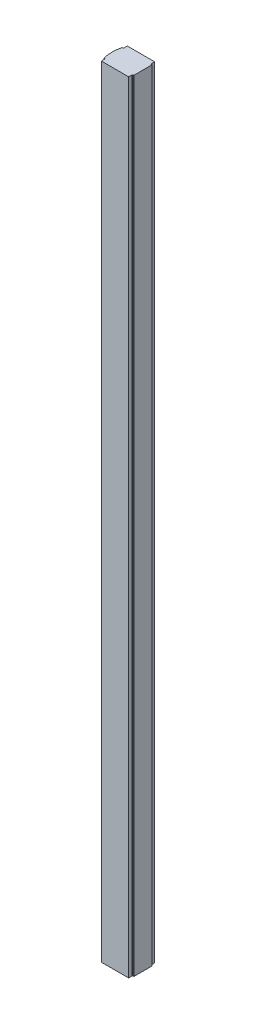
ISO-10303-21;
HEADER;
FILE_DESCRIPTION(('STEP AP214'),'2;1');
FILE_NAME('part.step','',(''),(''),'','','');
FILE_SCHEMA(('AUTOMOTIVE_DESIGN { 1 0 10303 214 1 1 1 1 }'));
ENDSEC;
DATA;
#1=APPLICATION_CONTEXT('core data for automotive mechanical design processes');
#2=APPLICATION_PROTOCOL_DEFINITION('international standard','automotive_design',2000,#1);
#3=PRODUCT_CONTEXT('',#1,'mechanical');
#4=PRODUCT('Part','Part','',(#3));
#5=PRODUCT_RELATED_PRODUCT_CATEGORY('part','',(#4));
#6=PRODUCT_DEFINITION_FORMATION('','',#4);
#7=PRODUCT_DEFINITION_CONTEXT('part definition',#1,'design');
#8=PRODUCT_DEFINITION('design','',#6,#7);
#9=PRODUCT_DEFINITION_SHAPE('','',#8);
#10=(LENGTH_UNIT() NAMED_UNIT(*) SI_UNIT(.MILLI.,.METRE.));
#11=(NAMED_UNIT(*) PLANE_ANGLE_UNIT() SI_UNIT($,.RADIAN.));
#12=(NAMED_UNIT(*) SI_UNIT($,.STERADIAN.) SOLID_ANGLE_UNIT());
#13=UNCERTAINTY_MEASURE_WITH_UNIT(LENGTH_MEASURE(1.E-05),#10,'distance_accuracy_value','');
#14=(GEOMETRIC_REPRESENTATION_CONTEXT(3) GLOBAL_UNCERTAINTY_ASSIGNED_CONTEXT((#13)) GLOBAL_UNIT_ASSIGNED_CONTEXT((#10,
#11,#12)) REPRESENTATION_CONTEXT('',''));
#15=CARTESIAN_POINT('',(0.,0.,0.));
#16=DIRECTION('',(0.,0.,1.));
#17=DIRECTION('',(1.,0.,0.));
#18=AXIS2_PLACEMENT_3D('',#15,#16,#17);
#19=CARTESIAN_POINT('',(0.,600.,0.));
#20=DIRECTION('',(0.,0.,-1.));
#21=DIRECTION('',(-1.,0.,0.));
#22=AXIS2_PLACEMENT_3D('',#19,#20,#21);
#23=PLANE('',#22);
#24=DIRECTION('',(1.,0.,0.));
#25=VECTOR('',#24,1.);
#26=CARTESIAN_POINT('',(0.,0.,0.));
#27=LINE('',#26,#25);
#28=CARTESIAN_POINT('',(0.,0.,0.));
#29=VERTEX_POINT('',#28);
#30=CARTESIAN_POINT('',(21.,0.,0.));
#31=VERTEX_POINT('',#30);
#32=EDGE_CURVE('E178',#29,#31,#27,.T.);
#33=ORIENTED_EDGE('',*,*,#32,.T.);
#34=DIRECTION('',(0.,-1.,0.));
#35=VECTOR('',#34,1.);
#36=CARTESIAN_POINT('',(21.,600.,0.));
#37=LINE('',#36,#35);
#38=CARTESIAN_POINT('',(21.,600.,0.));
#39=VERTEX_POINT('',#38);
#40=EDGE_CURVE('E11',#39,#31,#37,.T.);
#41=ORIENTED_EDGE('',*,*,#40,.F.);
#42=DIRECTION('',(1.,0.,0.));
#43=VECTOR('',#42,1.);
#44=CARTESIAN_POINT('',(0.,600.,0.));
#45=LINE('',#44,#43);
#46=CARTESIAN_POINT('',(0.,600.,0.));
#47=VERTEX_POINT('',#46);
#48=EDGE_CURVE('E111',#47,#39,#45,.T.);
#49=ORIENTED_EDGE('',*,*,#48,.F.);
#50=DIRECTION('',(0.,-1.,0.));
#51=VECTOR('',#50,1.);
#52=CARTESIAN_POINT('',(0.,600.,0.));
#53=LINE('',#52,#51);
#54=EDGE_CURVE('E50',#47,#29,#53,.T.);
#55=ORIENTED_EDGE('',*,*,#54,.T.);
#56=EDGE_LOOP('',(#33,#41,#49,#55));
#57=FACE_BOUND('',#56,.T.);
#58=ADVANCED_FACE('F34',(#57),#23,.F.);
#59=CARTESIAN_POINT('',(21.,600.,0.));
#60=DIRECTION('',(1.,0.,0.));
#61=DIRECTION('',(0.,0.,-1.));
#62=AXIS2_PLACEMENT_3D('',#59,#60,#61);
#63=PLANE('',#62);
#64=DIRECTION('',(0.,0.,1.));
#65=VECTOR('',#64,1.);
#66=CARTESIAN_POINT('',(21.,0.,0.));
#67=LINE('',#66,#65);
#68=CARTESIAN_POINT('',(21.,0.,-2.5));
#69=VERTEX_POINT('',#68);
#70=EDGE_CURVE('E180',#69,#31,#67,.T.);
#71=ORIENTED_EDGE('',*,*,#70,.F.);
#72=DIRECTION('',(0.,-1.,0.));
#73=VECTOR('',#72,1.);
#74=CARTESIAN_POINT('',(21.,600.,-2.5));
#75=LINE('',#74,#73);
#76=CARTESIAN_POINT('',(21.,600.,-2.5));
#77=VERTEX_POINT('',#76);
#78=EDGE_CURVE('E42',#77,#69,#75,.T.);
#79=ORIENTED_EDGE('',*,*,#78,.F.);
#80=DIRECTION('',(0.,0.,1.));
#81=VECTOR('',#80,1.);
#82=CARTESIAN_POINT('',(21.,600.,0.));
#83=LINE('',#82,#81);
#84=EDGE_CURVE('E257',#77,#39,#83,.T.);
#85=ORIENTED_EDGE('',*,*,#84,.T.);
#86=ORIENTED_EDGE('',*,*,#40,.T.);
#87=EDGE_LOOP('',(#71,#79,#85,#86));
#88=FACE_BOUND('',#87,.T.);
#89=ADVANCED_FACE('F256',(#88),#63,.T.);
#90=CARTESIAN_POINT('',(21.5,600.,-2.5));
#91=DIRECTION('',(0.,-1.,0.));
#92=DIRECTION('',(0.,0.,-1.));
#93=AXIS2_PLACEMENT_3D('',#90,#91,#92);
#94=CYLINDRICAL_SURFACE('',#93,0.5);
#95=CARTESIAN_POINT('',(21.5,0.,-2.5));
#96=DIRECTION('',(0.,1.,0.));
#97=DIRECTION('',(0.,0.,1.));
#98=AXIS2_PLACEMENT_3D('',#95,#96,#97);
#99=CIRCLE('',#98,0.5);
#100=CARTESIAN_POINT('',(21.5,0.,-3.));
#101=VERTEX_POINT('',#100);
#102=EDGE_CURVE('E183',#69,#101,#99,.F.);
#103=ORIENTED_EDGE('',*,*,#102,.T.);
#104=DIRECTION('',(0.,-1.,0.));
#105=VECTOR('',#104,1.);
#106=CARTESIAN_POINT('',(21.5,600.,-3.));
#107=LINE('',#106,#105);
#108=CARTESIAN_POINT('',(21.5,600.,-3.));
#109=VERTEX_POINT('',#108);
#110=EDGE_CURVE('E242',#109,#101,#107,.T.);
#111=ORIENTED_EDGE('',*,*,#110,.F.);
#112=CARTESIAN_POINT('',(21.5,600.,-2.5));
#113=DIRECTION('',(0.,1.,0.));
#114=DIRECTION('',(0.,0.,1.));
#115=AXIS2_PLACEMENT_3D('',#112,#113,#114);
#116=CIRCLE('',#115,0.5);
#117=EDGE_CURVE('E248',#77,#109,#116,.F.);
#118=ORIENTED_EDGE('',*,*,#117,.F.);
#119=ORIENTED_EDGE('',*,*,#78,.T.);
#120=EDGE_LOOP('',(#103,#111,#118,#119));
#121=FACE_BOUND('',#120,.T.);
#122=ADVANCED_FACE('F246',(#121),#94,.F.);
#123=CARTESIAN_POINT('',(0.,600.,-3.00000000000004));
#124=DIRECTION('',(0.,0.,1.));
#125=DIRECTION('',(1.,0.,0.));
#126=AXIS2_PLACEMENT_3D('',#123,#124,#125);
#127=PLANE('',#126);
#128=DIRECTION('',(-1.,0.,0.));
#129=VECTOR('',#128,1.);
#130=CARTESIAN_POINT('',(0.,0.,-3.00000000000004));
#131=LINE('',#130,#129);
#132=CARTESIAN_POINT('',(22.,0.,-3.));
#133=VERTEX_POINT('',#132);
#134=EDGE_CURVE('E186',#133,#101,#131,.T.);
#135=ORIENTED_EDGE('',*,*,#134,.F.);
#136=DIRECTION('',(0.,-1.,0.));
#137=VECTOR('',#136,1.);
#138=CARTESIAN_POINT('',(22.,600.,-3.));
#139=LINE('',#138,#137);
#140=CARTESIAN_POINT('',(22.,600.,-3.));
#141=VERTEX_POINT('',#140);
#142=EDGE_CURVE('E240',#141,#133,#139,.T.);
#143=ORIENTED_EDGE('',*,*,#142,.F.);
#144=DIRECTION('',(-1.,0.,0.));
#145=VECTOR('',#144,1.);
#146=CARTESIAN_POINT('',(0.,600.,-3.00000000000004));
#147=LINE('',#146,#145);
#148=EDGE_CURVE('E464',#141,#109,#147,.T.);
#149=ORIENTED_EDGE('',*,*,#148,.T.);
#150=ORIENTED_EDGE('',*,*,#110,.T.);
#151=EDGE_LOOP('',(#135,#143,#149,#150));
#152=FACE_BOUND('',#151,.T.);
#153=ADVANCED_FACE('F275',(#152),#127,.T.);
#154=CARTESIAN_POINT('',(22.,600.,0.));
#155=DIRECTION('',(-1.,0.,0.));
#156=DIRECTION('',(0.,0.,1.));
#157=AXIS2_PLACEMENT_3D('',#154,#155,#156);
#158=PLANE('',#157);
#159=DIRECTION('',(0.,0.,-1.));
#160=VECTOR('',#159,1.);
#161=CARTESIAN_POINT('',(22.,0.,0.));
#162=LINE('',#161,#160);
#163=CARTESIAN_POINT('',(22.,0.,-17.));
#164=VERTEX_POINT('',#163);
#165=EDGE_CURVE('E189',#133,#164,#162,.T.);
#166=ORIENTED_EDGE('',*,*,#165,.T.);
#167=DIRECTION('',(0.,-1.,0.));
#168=VECTOR('',#167,1.);
#169=CARTESIAN_POINT('',(22.,600.,-17.));
#170=LINE('',#169,#168);
#171=CARTESIAN_POINT('',(22.,600.,-17.));
#172=VERTEX_POINT('',#171);
#173=EDGE_CURVE('E237',#172,#164,#170,.T.);
#174=ORIENTED_EDGE('',*,*,#173,.F.);
#175=DIRECTION('',(0.,0.,-1.));
#176=VECTOR('',#175,1.);
#177=CARTESIAN_POINT('',(22.,600.,0.));
#178=LINE('',#177,#176);
#179=EDGE_CURVE('E461',#141,#172,#178,.T.);
#180=ORIENTED_EDGE('',*,*,#179,.F.);
#181=ORIENTED_EDGE('',*,*,#142,.T.);
#182=EDGE_LOOP('',(#166,#174,#180,#181));
#183=FACE_BOUND('',#182,.T.);
#184=ADVANCED_FACE('F280',(#183),#158,.F.);
#185=CARTESIAN_POINT('',(-1.17961196366421E-13,600.,-16.9999999999998));
#186=DIRECTION('',(0.,0.,1.));
#187=DIRECTION('',(1.,0.,0.));
#188=AXIS2_PLACEMENT_3D('',#185,#186,#187);
#189=PLANE('',#188);
#190=DIRECTION('',(-1.,0.,0.));
#191=VECTOR('',#190,1.);
#192=CARTESIAN_POINT('',(-1.17961196366421E-13,0.,-16.9999999999998));
#193=LINE('',#192,#191);
#194=CARTESIAN_POINT('',(21.5,0.,-17.));
#195=VERTEX_POINT('',#194);
#196=EDGE_CURVE('E191',#164,#195,#193,.T.);
#197=ORIENTED_EDGE('',*,*,#196,.T.);
#198=DIRECTION('',(0.,-1.,0.));
#199=VECTOR('',#198,1.);
#200=CARTESIAN_POINT('',(21.5,600.,-17.));
#201=LINE('',#200,#199);
#202=CARTESIAN_POINT('',(21.5,600.,-17.));
#203=VERTEX_POINT('',#202);
#204=EDGE_CURVE('E234',#203,#195,#201,.T.);
#205=ORIENTED_EDGE('',*,*,#204,.F.);
#206=DIRECTION('',(-1.,0.,0.));
#207=VECTOR('',#206,1.);
#208=CARTESIAN_POINT('',(-1.17961196366421E-13,600.,-16.9999999999998));
#209=LINE('',#208,#207);
#210=EDGE_CURVE('E458',#172,#203,#209,.T.);
#211=ORIENTED_EDGE('',*,*,#210,.F.);
#212=ORIENTED_EDGE('',*,*,#173,.T.);
#213=EDGE_LOOP('',(#197,#205,#211,#212));
#214=FACE_BOUND('',#213,.T.);
#215=ADVANCED_FACE('F284',(#214),#189,.F.);
#216=CARTESIAN_POINT('',(21.5,600.,-17.5));
#217=DIRECTION('',(0.,-1.,0.));
#218=DIRECTION('',(0.,0.,-1.));
#219=AXIS2_PLACEMENT_3D('',#216,#217,#218);
#220=CYLINDRICAL_SURFACE('',#219,0.5);
#221=CARTESIAN_POINT('',(21.5,0.,-17.5));
#222=DIRECTION('',(0.,1.,0.));
#223=DIRECTION('',(0.,0.,1.));
#224=AXIS2_PLACEMENT_3D('',#221,#222,#223);
#225=CIRCLE('',#224,0.5);
#226=CARTESIAN_POINT('',(21.,0.,-17.5));
#227=VERTEX_POINT('',#226);
#228=EDGE_CURVE('E193',#195,#227,#225,.F.);
#229=ORIENTED_EDGE('',*,*,#228,.T.);
#230=DIRECTION('',(0.,-1.,0.));
#231=VECTOR('',#230,1.);
#232=CARTESIAN_POINT('',(21.,600.,-17.5));
#233=LINE('',#232,#231);
#234=CARTESIAN_POINT('',(21.,600.,-17.5));
#235=VERTEX_POINT('',#234);
#236=EDGE_CURVE('E231',#235,#227,#233,.T.);
#237=ORIENTED_EDGE('',*,*,#236,.F.);
#238=CARTESIAN_POINT('',(21.5,600.,-17.5));
#239=DIRECTION('',(0.,1.,0.));
#240=DIRECTION('',(0.,0.,1.));
#241=AXIS2_PLACEMENT_3D('',#238,#239,#240);
#242=CIRCLE('',#241,0.5);
#243=EDGE_CURVE('E456',#203,#235,#242,.F.);
#244=ORIENTED_EDGE('',*,*,#243,.F.);
#245=ORIENTED_EDGE('',*,*,#204,.T.);
#246=EDGE_LOOP('',(#229,#237,#244,#245));
#247=FACE_BOUND('',#246,.T.);
#248=ADVANCED_FACE('F288',(#247),#220,.F.);
#249=CARTESIAN_POINT('',(21.,600.,0.));
#250=DIRECTION('',(-1.,0.,0.));
#251=DIRECTION('',(0.,0.,1.));
#252=AXIS2_PLACEMENT_3D('',#249,#250,#251);
#253=PLANE('',#252);
#254=DIRECTION('',(0.,0.,-1.));
#255=VECTOR('',#254,1.);
#256=CARTESIAN_POINT('',(21.,0.,0.));
#257=LINE('',#256,#255);
#258=CARTESIAN_POINT('',(21.,0.,-20.));
#259=VERTEX_POINT('',#258);
#260=EDGE_CURVE('E195',#227,#259,#257,.T.);
#261=ORIENTED_EDGE('',*,*,#260,.T.);
#262=DIRECTION('',(0.,-1.,0.));
#263=VECTOR('',#262,1.);
#264=CARTESIAN_POINT('',(21.,600.,-20.));
#265=LINE('',#264,#263);
#266=CARTESIAN_POINT('',(21.,600.,-20.));
#267=VERTEX_POINT('',#266);
#268=EDGE_CURVE('E229',#267,#259,#265,.T.);
#269=ORIENTED_EDGE('',*,*,#268,.F.);
#270=DIRECTION('',(0.,0.,-1.));
#271=VECTOR('',#270,1.);
#272=CARTESIAN_POINT('',(21.,600.,0.));
#273=LINE('',#272,#271);
#274=EDGE_CURVE('E472',#235,#267,#273,.T.);
#275=ORIENTED_EDGE('',*,*,#274,.F.);
#276=ORIENTED_EDGE('',*,*,#236,.T.);
#277=EDGE_LOOP('',(#261,#269,#275,#276));
#278=FACE_BOUND('',#277,.T.);
#279=ADVANCED_FACE('F292',(#278),#253,.F.);
#280=CARTESIAN_POINT('',(0.,600.,-20.));
#281=DIRECTION('',(0.,0.,-1.));
#282=DIRECTION('',(-1.,0.,0.));
#283=AXIS2_PLACEMENT_3D('',#280,#281,#282);
#284=PLANE('',#283);
#285=DIRECTION('',(1.,0.,0.));
#286=VECTOR('',#285,1.);
#287=CARTESIAN_POINT('',(0.,0.,-20.));
#288=LINE('',#287,#286);
#289=CARTESIAN_POINT('',(0.,0.,-20.));
#290=VERTEX_POINT('',#289);
#291=EDGE_CURVE('E198',#290,#259,#288,.T.);
#292=ORIENTED_EDGE('',*,*,#291,.F.);
#293=DIRECTION('',(0.,-1.,0.));
#294=VECTOR('',#293,1.);
#295=CARTESIAN_POINT('',(0.,600.,-20.));
#296=LINE('',#295,#294);
#297=CARTESIAN_POINT('',(0.,600.,-20.));
#298=VERTEX_POINT('',#297);
#299=EDGE_CURVE('E227',#298,#290,#296,.T.);
#300=ORIENTED_EDGE('',*,*,#299,.F.);
#301=DIRECTION('',(1.,0.,0.));
#302=VECTOR('',#301,1.);
#303=CARTESIAN_POINT('',(0.,600.,-20.));
#304=LINE('',#303,#302);
#305=EDGE_CURVE('E449',#298,#267,#304,.T.);
#306=ORIENTED_EDGE('',*,*,#305,.T.);
#307=ORIENTED_EDGE('',*,*,#268,.T.);
#308=EDGE_LOOP('',(#292,#300,#306,#307));
#309=FACE_BOUND('',#308,.T.);
#310=ADVANCED_FACE('F296',(#309),#284,.T.);
#311=CARTESIAN_POINT('',(0.,600.,0.));
#312=DIRECTION('',(-1.,0.,0.));
#313=DIRECTION('',(0.,0.,1.));
#314=AXIS2_PLACEMENT_3D('',#311,#312,#313);
#315=PLANE('',#314);
#316=DIRECTION('',(0.,0.,-1.));
#317=VECTOR('',#316,1.);
#318=CARTESIAN_POINT('',(0.,0.,0.));
#319=LINE('',#318,#317);
#320=CARTESIAN_POINT('',(0.,0.,-17.5));
#321=VERTEX_POINT('',#320);
#322=EDGE_CURVE('E201',#321,#290,#319,.T.);
#323=ORIENTED_EDGE('',*,*,#322,.F.);
#324=DIRECTION('',(0.,-1.,0.));
#325=VECTOR('',#324,1.);
#326=CARTESIAN_POINT('',(0.,600.,-17.5));
#327=LINE('',#326,#325);
#328=CARTESIAN_POINT('',(0.,600.,-17.5));
#329=VERTEX_POINT('',#328);
#330=EDGE_CURVE('E225',#329,#321,#327,.T.);
#331=ORIENTED_EDGE('',*,*,#330,.F.);
#332=DIRECTION('',(0.,0.,-1.));
#333=VECTOR('',#332,1.);
#334=CARTESIAN_POINT('',(0.,600.,0.));
#335=LINE('',#334,#333);
#336=EDGE_CURVE('E445',#329,#298,#335,.T.);
#337=ORIENTED_EDGE('',*,*,#336,.T.);
#338=ORIENTED_EDGE('',*,*,#299,.T.);
#339=EDGE_LOOP('',(#323,#331,#337,#338));
#340=FACE_BOUND('',#339,.T.);
#341=ADVANCED_FACE('F300',(#340),#315,.T.);
#342=CARTESIAN_POINT('',(-0.5,600.,-17.5));
#343=DIRECTION('',(0.,-1.,0.));
#344=DIRECTION('',(0.,0.,-1.));
#345=AXIS2_PLACEMENT_3D('',#342,#343,#344);
#346=CYLINDRICAL_SURFACE('',#345,0.5);
#347=CARTESIAN_POINT('',(-0.5,0.,-17.5));
#348=DIRECTION('',(0.,1.,0.));
#349=DIRECTION('',(0.,0.,1.));
#350=AXIS2_PLACEMENT_3D('',#347,#348,#349);
#351=CIRCLE('',#350,0.5);
#352=CARTESIAN_POINT('',(-0.5,0.,-17.));
#353=VERTEX_POINT('',#352);
#354=EDGE_CURVE('E204',#353,#321,#351,.T.);
#355=ORIENTED_EDGE('',*,*,#354,.F.);
#356=DIRECTION('',(0.,-1.,0.));
#357=VECTOR('',#356,1.);
#358=CARTESIAN_POINT('',(-0.5,600.,-17.));
#359=LINE('',#358,#357);
#360=CARTESIAN_POINT('',(-0.5,600.,-17.));
#361=VERTEX_POINT('',#360);
#362=EDGE_CURVE('E223',#361,#353,#359,.T.);
#363=ORIENTED_EDGE('',*,*,#362,.F.);
#364=CARTESIAN_POINT('',(-0.5,600.,-17.5));
#365=DIRECTION('',(0.,1.,0.));
#366=DIRECTION('',(0.,0.,1.));
#367=AXIS2_PLACEMENT_3D('',#364,#365,#366);
#368=CIRCLE('',#367,0.5);
#369=EDGE_CURVE('E476',#361,#329,#368,.T.);
#370=ORIENTED_EDGE('',*,*,#369,.T.);
#371=ORIENTED_EDGE('',*,*,#330,.T.);
#372=EDGE_LOOP('',(#355,#363,#370,#371));
#373=FACE_BOUND('',#372,.T.);
#374=ADVANCED_FACE('F304',(#373),#346,.F.);
#375=CARTESIAN_POINT('',(1.17961196366422E-13,600.,-17.));
#376=DIRECTION('',(0.,0.,-1.));
#377=DIRECTION('',(-1.,0.,0.));
#378=AXIS2_PLACEMENT_3D('',#375,#376,#377);
#379=PLANE('',#378);
#380=DIRECTION('',(1.,0.,0.));
#381=VECTOR('',#380,1.);
#382=CARTESIAN_POINT('',(1.17961196366422E-13,0.,-17.));
#383=LINE('',#382,#381);
#384=CARTESIAN_POINT('',(-1.,0.,-17.));
#385=VERTEX_POINT('',#384);
#386=EDGE_CURVE('E207',#385,#353,#383,.T.);
#387=ORIENTED_EDGE('',*,*,#386,.F.);
#388=DIRECTION('',(0.,-1.,0.));
#389=VECTOR('',#388,1.);
#390=CARTESIAN_POINT('',(-1.,600.,-17.));
#391=LINE('',#390,#389);
#392=CARTESIAN_POINT('',(-1.,600.,-17.));
#393=VERTEX_POINT('',#392);
#394=EDGE_CURVE('E221',#393,#385,#391,.T.);
#395=ORIENTED_EDGE('',*,*,#394,.F.);
#396=DIRECTION('',(1.,0.,0.));
#397=VECTOR('',#396,1.);
#398=CARTESIAN_POINT('',(1.17961196366422E-13,600.,-17.));
#399=LINE('',#398,#397);
#400=EDGE_CURVE('E437',#393,#361,#399,.T.);
#401=ORIENTED_EDGE('',*,*,#400,.T.);
#402=ORIENTED_EDGE('',*,*,#362,.T.);
#403=EDGE_LOOP('',(#387,#395,#401,#402));
#404=FACE_BOUND('',#403,.T.);
#405=ADVANCED_FACE('F308',(#404),#379,.T.);
#406=CARTESIAN_POINT('',(28.1719042916296,600.,-10.));
#407=DIRECTION('',(0.,-1.,0.));
#408=DIRECTION('',(0.,0.,-1.));
#409=AXIS2_PLACEMENT_3D('',#406,#407,#408);
#410=CYLINDRICAL_SURFACE('',#409,30.);
#411=CARTESIAN_POINT('',(28.1719042916296,0.,-10.));
#412=DIRECTION('',(0.,1.,0.));
#413=DIRECTION('',(0.,0.,1.));
#414=AXIS2_PLACEMENT_3D('',#411,#412,#413);
#415=CIRCLE('',#414,30.);
#416=CARTESIAN_POINT('',(-1.,0.,-3.));
#417=VERTEX_POINT('',#416);
#418=EDGE_CURVE('E210',#385,#417,#415,.T.);
#419=ORIENTED_EDGE('',*,*,#418,.T.);
#420=DIRECTION('',(0.,-1.,0.));
#421=VECTOR('',#420,1.);
#422=CARTESIAN_POINT('',(-1.,600.,-3.));
#423=LINE('',#422,#421);
#424=CARTESIAN_POINT('',(-1.,600.,-3.));
#425=VERTEX_POINT('',#424);
#426=EDGE_CURVE('E170',#425,#417,#423,.T.);
#427=ORIENTED_EDGE('',*,*,#426,.F.);
#428=CARTESIAN_POINT('',(28.1719042916296,600.,-10.));
#429=DIRECTION('',(0.,1.,0.));
#430=DIRECTION('',(0.,0.,1.));
#431=AXIS2_PLACEMENT_3D('',#428,#429,#430);
#432=CIRCLE('',#431,30.);
#433=EDGE_CURVE('E158',#393,#425,#432,.T.);
#434=ORIENTED_EDGE('',*,*,#433,.F.);
#435=ORIENTED_EDGE('',*,*,#394,.T.);
#436=EDGE_LOOP('',(#419,#427,#434,#435));
#437=FACE_BOUND('',#436,.T.);
#438=ADVANCED_FACE('F312',(#437),#410,.T.);
#439=CARTESIAN_POINT('',(0.,600.,-3.));
#440=DIRECTION('',(0.,0.,-1.));
#441=DIRECTION('',(-1.,0.,0.));
#442=AXIS2_PLACEMENT_3D('',#439,#440,#441);
#443=PLANE('',#442);
#444=DIRECTION('',(1.,0.,0.));
#445=VECTOR('',#444,1.);
#446=CARTESIAN_POINT('',(0.,0.,-3.));
#447=LINE('',#446,#445);
#448=CARTESIAN_POINT('',(-0.5,0.,-3.));
#449=VERTEX_POINT('',#448);
#450=EDGE_CURVE('E167',#417,#449,#447,.T.);
#451=ORIENTED_EDGE('',*,*,#450,.T.);
#452=DIRECTION('',(0.,-1.,0.));
#453=VECTOR('',#452,1.);
#454=CARTESIAN_POINT('',(-0.5,600.,-3.));
#455=LINE('',#454,#453);
#456=CARTESIAN_POINT('',(-0.5,600.,-3.));
#457=VERTEX_POINT('',#456);
#458=EDGE_CURVE('E164',#457,#449,#455,.T.);
#459=ORIENTED_EDGE('',*,*,#458,.F.);
#460=DIRECTION('',(1.,0.,0.));
#461=VECTOR('',#460,1.);
#462=CARTESIAN_POINT('',(0.,600.,-3.));
#463=LINE('',#462,#461);
#464=EDGE_CURVE('E151',#425,#457,#463,.T.);
#465=ORIENTED_EDGE('',*,*,#464,.F.);
#466=ORIENTED_EDGE('',*,*,#426,.T.);
#467=EDGE_LOOP('',(#451,#459,#465,#466));
#468=FACE_BOUND('',#467,.T.);
#469=ADVANCED_FACE('F165',(#468),#443,.F.);
#470=CARTESIAN_POINT('',(-0.5,600.,-2.5));
#471=DIRECTION('',(0.,-1.,0.));
#472=DIRECTION('',(0.,0.,-1.));
#473=AXIS2_PLACEMENT_3D('',#470,#471,#472);
#474=CYLINDRICAL_SURFACE('',#473,0.5);
#475=CARTESIAN_POINT('',(-0.5,0.,-2.5));
#476=DIRECTION('',(0.,1.,0.));
#477=DIRECTION('',(0.,0.,1.));
#478=AXIS2_PLACEMENT_3D('',#475,#476,#477);
#479=CIRCLE('',#478,0.5);
#480=CARTESIAN_POINT('',(0.,0.,-2.5));
#481=VERTEX_POINT('',#480);
#482=EDGE_CURVE('E213',#481,#449,#479,.T.);
#483=ORIENTED_EDGE('',*,*,#482,.F.);
#484=DIRECTION('',(0.,-1.,0.));
#485=VECTOR('',#484,1.);
#486=CARTESIAN_POINT('',(0.,600.,-2.5));
#487=LINE('',#486,#485);
#488=CARTESIAN_POINT('',(0.,600.,-2.5));
#489=VERTEX_POINT('',#488);
#490=EDGE_CURVE('E99',#489,#481,#487,.T.);
#491=ORIENTED_EDGE('',*,*,#490,.F.);
#492=CARTESIAN_POINT('',(-0.5,600.,-2.5));
#493=DIRECTION('',(0.,1.,0.));
#494=DIRECTION('',(0.,0.,1.));
#495=AXIS2_PLACEMENT_3D('',#492,#493,#494);
#496=CIRCLE('',#495,0.5);
#497=EDGE_CURVE('E155',#489,#457,#496,.T.);
#498=ORIENTED_EDGE('',*,*,#497,.T.);
#499=ORIENTED_EDGE('',*,*,#458,.T.);
#500=EDGE_LOOP('',(#483,#491,#498,#499));
#501=FACE_BOUND('',#500,.T.);
#502=ADVANCED_FACE('F172',(#501),#474,.F.);
#503=CARTESIAN_POINT('',(0.,600.,0.));
#504=DIRECTION('',(-1.,0.,0.));
#505=DIRECTION('',(0.,0.,1.));
#506=AXIS2_PLACEMENT_3D('',#503,#504,#505);
#507=PLANE('',#506);
#508=DIRECTION('',(0.,0.,-1.));
#509=VECTOR('',#508,1.);
#510=CARTESIAN_POINT('',(0.,0.,0.));
#511=LINE('',#510,#509);
#512=EDGE_CURVE('E215',#29,#481,#511,.T.);
#513=ORIENTED_EDGE('',*,*,#512,.F.);
#514=ORIENTED_EDGE('',*,*,#54,.F.);
#515=DIRECTION('',(0.,0.,-1.));
#516=VECTOR('',#515,1.);
#517=CARTESIAN_POINT('',(0.,600.,0.));
#518=LINE('',#517,#516);
#519=EDGE_CURVE('E173',#47,#489,#518,.T.);
#520=ORIENTED_EDGE('',*,*,#519,.T.);
#521=ORIENTED_EDGE('',*,*,#490,.T.);
#522=EDGE_LOOP('',(#513,#514,#520,#521));
#523=FACE_BOUND('',#522,.T.);
#524=ADVANCED_FACE('F258',(#523),#507,.T.);
#525=CARTESIAN_POINT('',(0.,600.,0.));
#526=DIRECTION('',(0.,1.,0.));
#527=DIRECTION('',(0.,0.,1.));
#528=AXIS2_PLACEMENT_3D('',#525,#526,#527);
#529=PLANE('',#528);
#530=ORIENTED_EDGE('',*,*,#48,.T.);
#531=ORIENTED_EDGE('',*,*,#84,.F.);
#532=ORIENTED_EDGE('',*,*,#117,.T.);
#533=ORIENTED_EDGE('',*,*,#148,.F.);
#534=ORIENTED_EDGE('',*,*,#179,.T.);
#535=ORIENTED_EDGE('',*,*,#210,.T.);
#536=ORIENTED_EDGE('',*,*,#243,.T.);
#537=ORIENTED_EDGE('',*,*,#274,.T.);
#538=ORIENTED_EDGE('',*,*,#305,.F.);
#539=ORIENTED_EDGE('',*,*,#336,.F.);
#540=ORIENTED_EDGE('',*,*,#369,.F.);
#541=ORIENTED_EDGE('',*,*,#400,.F.);
#542=ORIENTED_EDGE('',*,*,#433,.T.);
#543=ORIENTED_EDGE('',*,*,#464,.T.);
#544=ORIENTED_EDGE('',*,*,#497,.F.);
#545=ORIENTED_EDGE('',*,*,#519,.F.);
#546=EDGE_LOOP('',(#530,#531,#532,#533,#534,#535,#536,#537,#538,#539,#540,#541,#542,#543,#544,#545));
#547=FACE_BOUND('',#546,.T.);
#548=ADVANCED_FACE('F153',(#547),#529,.T.);
#549=CARTESIAN_POINT('',(0.,0.,0.));
#550=DIRECTION('',(0.,1.,0.));
#551=DIRECTION('',(0.,0.,1.));
#552=AXIS2_PLACEMENT_3D('',#549,#550,#551);
#553=PLANE('',#552);
#554=ORIENTED_EDGE('',*,*,#32,.F.);
#555=ORIENTED_EDGE('',*,*,#512,.T.);
#556=ORIENTED_EDGE('',*,*,#482,.T.);
#557=ORIENTED_EDGE('',*,*,#450,.F.);
#558=ORIENTED_EDGE('',*,*,#418,.F.);
#559=ORIENTED_EDGE('',*,*,#386,.T.);
#560=ORIENTED_EDGE('',*,*,#354,.T.);
#561=ORIENTED_EDGE('',*,*,#322,.T.);
#562=ORIENTED_EDGE('',*,*,#291,.T.);
#563=ORIENTED_EDGE('',*,*,#260,.F.);
#564=ORIENTED_EDGE('',*,*,#228,.F.);
#565=ORIENTED_EDGE('',*,*,#196,.F.);
#566=ORIENTED_EDGE('',*,*,#165,.F.);
#567=ORIENTED_EDGE('',*,*,#134,.T.);
#568=ORIENTED_EDGE('',*,*,#102,.F.);
#569=ORIENTED_EDGE('',*,*,#70,.T.);
#570=EDGE_LOOP('',(#554,#555,#556,#557,#558,#559,#560,#561,#562,#563,#564,#565,#566,#567,#568,#569));
#571=FACE_BOUND('',#570,.T.);
#572=ADVANCED_FACE('F253',(#571),#553,.F.);
#573=CLOSED_SHELL('',(#58,#89,#122,#153,#184,#215,#248,#279,#310,#341,#374,#405,#438,#469,#502,
#524,#548,#572));
#574=MANIFOLD_SOLID_BREP('B2',#573);
#575=ADVANCED_BREP_SHAPE_REPRESENTATION('',(#18,#574),#14);
#576=SHAPE_DEFINITION_REPRESENTATION(#9,#575);
ENDSEC;
END-ISO-10303-21;
